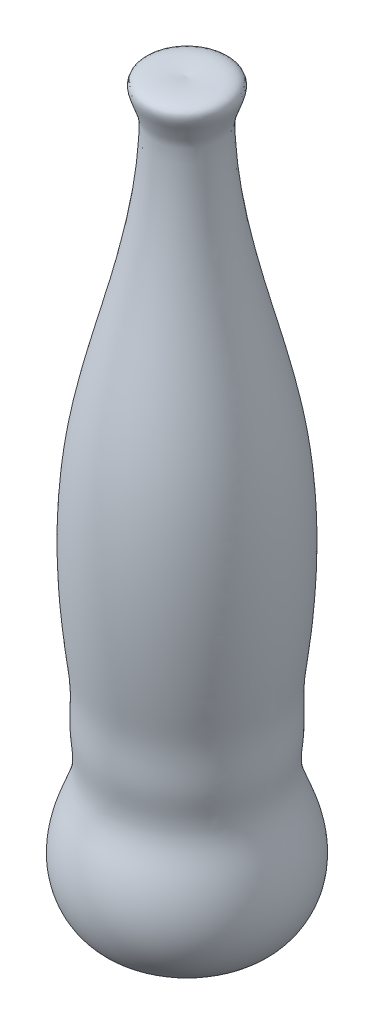
ISO-10303-21;
HEADER;
FILE_DESCRIPTION(('STEP AP214'),'2;1');
FILE_NAME('part.step','',(''),(''),'','','');
FILE_SCHEMA(('AUTOMOTIVE_DESIGN { 1 0 10303 214 1 1 1 1 }'));
ENDSEC;
DATA;
#1=APPLICATION_CONTEXT('core data for automotive mechanical design processes');
#2=APPLICATION_PROTOCOL_DEFINITION('international standard','automotive_design',2000,#1);
#3=PRODUCT_CONTEXT('',#1,'mechanical');
#4=PRODUCT('Part','Part','',(#3));
#5=PRODUCT_RELATED_PRODUCT_CATEGORY('part','',(#4));
#6=PRODUCT_DEFINITION_FORMATION('','',#4);
#7=PRODUCT_DEFINITION_CONTEXT('part definition',#1,'design');
#8=PRODUCT_DEFINITION('design','',#6,#7);
#9=PRODUCT_DEFINITION_SHAPE('','',#8);
#10=(LENGTH_UNIT() NAMED_UNIT(*) SI_UNIT(.MILLI.,.METRE.));
#11=(NAMED_UNIT(*) PLANE_ANGLE_UNIT() SI_UNIT($,.RADIAN.));
#12=(NAMED_UNIT(*) SI_UNIT($,.STERADIAN.) SOLID_ANGLE_UNIT());
#13=UNCERTAINTY_MEASURE_WITH_UNIT(LENGTH_MEASURE(1.E-05),#10,'distance_accuracy_value','');
#14=(GEOMETRIC_REPRESENTATION_CONTEXT(3) GLOBAL_UNCERTAINTY_ASSIGNED_CONTEXT((#13)) GLOBAL_UNIT_ASSIGNED_CONTEXT((#10,
#11,#12)) REPRESENTATION_CONTEXT('',''));
#15=CARTESIAN_POINT('',(0.,0.,0.));
#16=DIRECTION('',(0.,0.,1.));
#17=DIRECTION('',(1.,0.,0.));
#18=AXIS2_PLACEMENT_3D('',#15,#16,#17);
#19=CARTESIAN_POINT('',(0.,-13.937032387574,0.));
#20=CARTESIAN_POINT('',(1.35545616296281,-13.9829474682511,0.));
#21=CARTESIAN_POINT('',(4.21914820629659,-14.0766713027594,0.));
#22=CARTESIAN_POINT('',(5.98830185277871,-10.7038386666232,0.));
#23=CARTESIAN_POINT('',(5.50363652873155,-8.05008433043089,0.));
#24=CARTESIAN_POINT('',(4.44327180649139,-5.85355560811571,0.));
#25=CARTESIAN_POINT('',(4.83838824425151,-3.80165243131665,0.));
#26=CARTESIAN_POINT('',(4.66063313215664,-1.87307071612281,0.));
#27=CARTESIAN_POINT('',(5.06939485962581,1.03712178450327,0.));
#28=CARTESIAN_POINT('',(5.3973367014678,5.32537408777057,0.));
#29=CARTESIAN_POINT('',(5.00066477144695,11.7441537501941,0.));
#30=CARTESIAN_POINT('',(3.30411111636416,17.2764583369224,0.));
#31=CARTESIAN_POINT('',(2.2480790049247,22.2852925930788,0.));
#32=CARTESIAN_POINT('',(1.96165963657897,24.7917986790529,0.));
#33=CARTESIAN_POINT('',(1.90958561342814,27.6035443349261,0.));
#34=CARTESIAN_POINT('',(3.80841657384678,29.089108233952,0.));
#35=CARTESIAN_POINT('',(0.,28.5816730160279,0.));
#36=B_SPLINE_CURVE_WITH_KNOTS('',3,(#19,#20,#21,#22,#23,#24,#25,#26,#27,#28,#29,#30,#31,#32,#33,
#34,#35),.UNSPECIFIED.,.F.,.F.,(4,1,1,1,1,1,1,1,1,1,1,1,1,1,4),(0.,0.0908126415135923,
0.144815471300986,0.209981467657125,0.251516803537459,0.291137763306169,0.334316045860947,
0.370754543575573,0.471482760608888,0.599534863526335,0.764051265916899,0.82650345209536,
0.91511687663234,0.918715066845238,1.),.UNSPECIFIED.);
#37=CARTESIAN_POINT('',(0.,-13.937032387574,0.));
#38=DIRECTION('',(0.,-1.,0.));
#39=AXIS1_PLACEMENT('',#37,#38);
#40=SURFACE_OF_REVOLUTION('',#36,#39);
#41=CARTESIAN_POINT('',(0.,28.5816730160279,0.));
#42=VERTEX_POINT('',#41);
#43=VERTEX_LOOP('',#42);
#44=FACE_BOUND('',#43,.T.);
#45=CARTESIAN_POINT('',(0.,-13.937032387574,0.));
#46=VERTEX_POINT('',#45);
#47=VERTEX_LOOP('',#46);
#48=FACE_BOUND('',#47,.T.);
#49=ADVANCED_FACE('F38',(#44,#48),#40,.F.);
#50=CLOSED_SHELL('',(#49));
#51=MANIFOLD_SOLID_BREP('B2',#50);
#52=ADVANCED_BREP_SHAPE_REPRESENTATION('',(#18,#51),#14);
#53=SHAPE_DEFINITION_REPRESENTATION(#9,#52);
ENDSEC;
END-ISO-10303-21;
